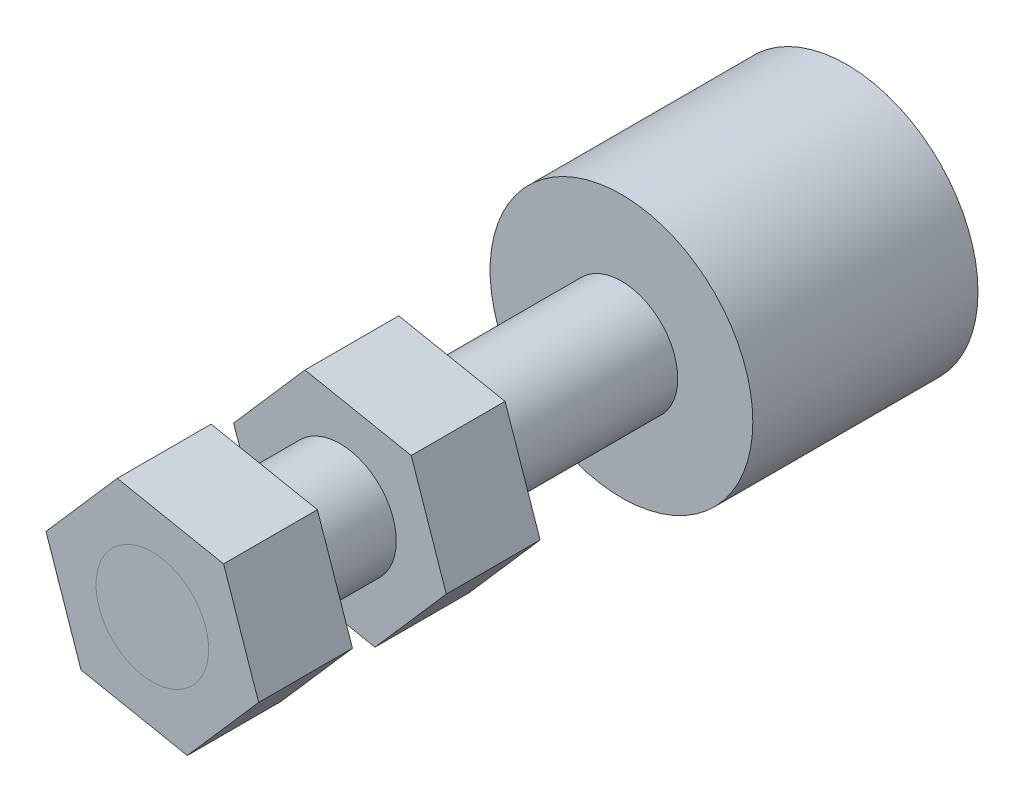
ISO-10303-21;
HEADER;
FILE_DESCRIPTION(('STEP AP214'),'2;1');
FILE_NAME('part.step','',(''),(''),'','','');
FILE_SCHEMA(('AUTOMOTIVE_DESIGN { 1 0 10303 214 1 1 1 1 }'));
ENDSEC;
DATA;
#1=APPLICATION_CONTEXT('core data for automotive mechanical design processes');
#2=APPLICATION_PROTOCOL_DEFINITION('international standard','automotive_design',2000,#1);
#3=PRODUCT_CONTEXT('',#1,'mechanical');
#4=PRODUCT('Part','Part','',(#3));
#5=PRODUCT_RELATED_PRODUCT_CATEGORY('part','',(#4));
#6=PRODUCT_DEFINITION_FORMATION('','',#4);
#7=PRODUCT_DEFINITION_CONTEXT('part definition',#1,'design');
#8=PRODUCT_DEFINITION('design','',#6,#7);
#9=PRODUCT_DEFINITION_SHAPE('','',#8);
#10=(LENGTH_UNIT() NAMED_UNIT(*) SI_UNIT(.MILLI.,.METRE.));
#11=(NAMED_UNIT(*) PLANE_ANGLE_UNIT() SI_UNIT($,.RADIAN.));
#12=(NAMED_UNIT(*) SI_UNIT($,.STERADIAN.) SOLID_ANGLE_UNIT());
#13=UNCERTAINTY_MEASURE_WITH_UNIT(LENGTH_MEASURE(1.E-05),#10,'distance_accuracy_value','');
#14=(GEOMETRIC_REPRESENTATION_CONTEXT(3) GLOBAL_UNCERTAINTY_ASSIGNED_CONTEXT((#13)) GLOBAL_UNIT_ASSIGNED_CONTEXT((#10,
#11,#12)) REPRESENTATION_CONTEXT('',''));
#15=CARTESIAN_POINT('',(0.,0.,0.));
#16=DIRECTION('',(0.,0.,1.));
#17=DIRECTION('',(1.,0.,0.));
#18=AXIS2_PLACEMENT_3D('',#15,#16,#17);
#19=CARTESIAN_POINT('',(5.66475932685164,-1.11527355486477,22.));
#20=DIRECTION('',(0.946299422095933,0.32329151510812,0.));
#21=DIRECTION('',(-0.32329151510812,0.946299422095933,0.));
#22=AXIS2_PLACEMENT_3D('',#19,#20,#21);
#23=PLANE('',#22);
#24=DIRECTION('',(-0.32329151510812,0.946299422095933,0.));
#25=VECTOR('',#24,1.);
#26=CARTESIAN_POINT('',(5.66475932685164,-1.11527355486477,27.));
#27=LINE('',#26,#25);
#28=CARTESIAN_POINT('',(5.66475932685164,-1.11527355486477,27.));
#29=VERTEX_POINT('',#28);
#30=CARTESIAN_POINT('',(3.79823489410769,4.34818870594597,27.));
#31=VERTEX_POINT('',#30);
#32=EDGE_CURVE('E134',#29,#31,#27,.T.);
#33=ORIENTED_EDGE('',*,*,#32,.F.);
#34=DIRECTION('',(0.,0.,1.));
#35=VECTOR('',#34,1.);
#36=CARTESIAN_POINT('',(5.66475932685164,-1.11527355486477,22.));
#37=LINE('',#36,#35);
#38=CARTESIAN_POINT('',(5.66475932685164,-1.11527355486477,22.));
#39=VERTEX_POINT('',#38);
#40=EDGE_CURVE('E12',#39,#29,#37,.T.);
#41=ORIENTED_EDGE('',*,*,#40,.F.);
#42=DIRECTION('',(-0.32329151510812,0.946299422095933,0.));
#43=VECTOR('',#42,1.);
#44=CARTESIAN_POINT('',(5.66475932685164,-1.11527355486477,22.));
#45=LINE('',#44,#43);
#46=CARTESIAN_POINT('',(3.79823489410769,4.34818870594597,22.));
#47=VERTEX_POINT('',#46);
#48=EDGE_CURVE('E149',#39,#47,#45,.T.);
#49=ORIENTED_EDGE('',*,*,#48,.T.);
#50=DIRECTION('',(0.,0.,1.));
#51=VECTOR('',#50,1.);
#52=CARTESIAN_POINT('',(3.79823489410769,4.34818870594597,22.));
#53=LINE('',#52,#51);
#54=EDGE_CURVE('E52',#47,#31,#53,.T.);
#55=ORIENTED_EDGE('',*,*,#54,.T.);
#56=EDGE_LOOP('',(#33,#41,#49,#55));
#57=FACE_BOUND('',#56,.T.);
#58=ADVANCED_FACE('F49',(#57),#23,.T.);
#59=CARTESIAN_POINT('',(1.86652443274395,-5.46346226081074,22.));
#60=DIRECTION('',(0.753128375959559,-0.657873581567551,0.));
#61=DIRECTION('',(0.657873581567551,0.753128375959559,0.));
#62=AXIS2_PLACEMENT_3D('',#59,#60,#61);
#63=PLANE('',#62);
#64=DIRECTION('',(0.657873581567551,0.753128375959559,0.));
#65=VECTOR('',#64,1.);
#66=CARTESIAN_POINT('',(1.86652443274395,-5.46346226081074,27.));
#67=LINE('',#66,#65);
#68=CARTESIAN_POINT('',(1.86652443274395,-5.46346226081074,27.));
#69=VERTEX_POINT('',#68);
#70=EDGE_CURVE('E147',#69,#29,#67,.T.);
#71=ORIENTED_EDGE('',*,*,#70,.F.);
#72=DIRECTION('',(0.,0.,1.));
#73=VECTOR('',#72,1.);
#74=CARTESIAN_POINT('',(1.86652443274395,-5.46346226081074,22.));
#75=LINE('',#74,#73);
#76=CARTESIAN_POINT('',(1.86652443274395,-5.46346226081074,22.));
#77=VERTEX_POINT('',#76);
#78=EDGE_CURVE('E58',#77,#69,#75,.T.);
#79=ORIENTED_EDGE('',*,*,#78,.F.);
#80=DIRECTION('',(0.657873581567551,0.753128375959559,0.));
#81=VECTOR('',#80,1.);
#82=CARTESIAN_POINT('',(1.86652443274395,-5.46346226081074,22.));
#83=LINE('',#82,#81);
#84=EDGE_CURVE('E124',#77,#39,#83,.T.);
#85=ORIENTED_EDGE('',*,*,#84,.T.);
#86=ORIENTED_EDGE('',*,*,#40,.T.);
#87=EDGE_LOOP('',(#71,#79,#85,#86));
#88=FACE_BOUND('',#87,.T.);
#89=ADVANCED_FACE('F157',(#88),#63,.T.);
#90=CARTESIAN_POINT('',(-3.79823489410769,-4.34818870594597,22.));
#91=DIRECTION('',(-0.193171046136374,-0.981165096675671,0.));
#92=DIRECTION('',(0.981165096675671,-0.193171046136374,0.));
#93=AXIS2_PLACEMENT_3D('',#90,#91,#92);
#94=PLANE('',#93);
#95=DIRECTION('',(0.981165096675671,-0.193171046136374,0.));
#96=VECTOR('',#95,1.);
#97=CARTESIAN_POINT('',(-3.79823489410769,-4.34818870594597,27.));
#98=LINE('',#97,#96);
#99=CARTESIAN_POINT('',(-3.79823489410769,-4.34818870594597,27.));
#100=VERTEX_POINT('',#99);
#101=EDGE_CURVE('E111',#100,#69,#98,.T.);
#102=ORIENTED_EDGE('',*,*,#101,.F.);
#103=DIRECTION('',(0.,0.,1.));
#104=VECTOR('',#103,1.);
#105=CARTESIAN_POINT('',(-3.79823489410769,-4.34818870594597,22.));
#106=LINE('',#105,#104);
#107=CARTESIAN_POINT('',(-3.79823489410769,-4.34818870594597,22.));
#108=VERTEX_POINT('',#107);
#109=EDGE_CURVE('E106',#108,#100,#106,.T.);
#110=ORIENTED_EDGE('',*,*,#109,.F.);
#111=DIRECTION('',(0.981165096675671,-0.193171046136374,0.));
#112=VECTOR('',#111,1.);
#113=CARTESIAN_POINT('',(-3.79823489410769,-4.34818870594597,22.));
#114=LINE('',#113,#112);
#115=EDGE_CURVE('E109',#108,#77,#114,.T.);
#116=ORIENTED_EDGE('',*,*,#115,.T.);
#117=ORIENTED_EDGE('',*,*,#78,.T.);
#118=EDGE_LOOP('',(#102,#110,#116,#117));
#119=FACE_BOUND('',#118,.T.);
#120=ADVANCED_FACE('F108',(#119),#94,.T.);
#121=CARTESIAN_POINT('',(-5.66475932685164,1.11527355486477,22.));
#122=DIRECTION('',(-0.946299422095933,-0.32329151510812,0.));
#123=DIRECTION('',(0.32329151510812,-0.946299422095933,0.));
#124=AXIS2_PLACEMENT_3D('',#121,#122,#123);
#125=PLANE('',#124);
#126=DIRECTION('',(0.32329151510812,-0.946299422095933,0.));
#127=VECTOR('',#126,1.);
#128=CARTESIAN_POINT('',(-5.66475932685164,1.11527355486477,27.));
#129=LINE('',#128,#127);
#130=CARTESIAN_POINT('',(-5.66475932685164,1.11527355486477,27.));
#131=VERTEX_POINT('',#130);
#132=EDGE_CURVE('E144',#131,#100,#129,.T.);
#133=ORIENTED_EDGE('',*,*,#132,.F.);
#134=DIRECTION('',(0.,0.,1.));
#135=VECTOR('',#134,1.);
#136=CARTESIAN_POINT('',(-5.66475932685164,1.11527355486477,22.));
#137=LINE('',#136,#135);
#138=CARTESIAN_POINT('',(-5.66475932685164,1.11527355486477,22.));
#139=VERTEX_POINT('',#138);
#140=EDGE_CURVE('E116',#139,#131,#137,.T.);
#141=ORIENTED_EDGE('',*,*,#140,.F.);
#142=DIRECTION('',(0.32329151510812,-0.946299422095933,0.));
#143=VECTOR('',#142,1.);
#144=CARTESIAN_POINT('',(-5.66475932685164,1.11527355486477,22.));
#145=LINE('',#144,#143);
#146=EDGE_CURVE('E122',#139,#108,#145,.T.);
#147=ORIENTED_EDGE('',*,*,#146,.T.);
#148=ORIENTED_EDGE('',*,*,#109,.T.);
#149=EDGE_LOOP('',(#133,#141,#147,#148));
#150=FACE_BOUND('',#149,.T.);
#151=ADVANCED_FACE('F126',(#150),#125,.T.);
#152=CARTESIAN_POINT('',(-1.86652443274395,5.46346226081074,22.));
#153=DIRECTION('',(-0.753128375959559,0.657873581567551,0.));
#154=DIRECTION('',(-0.657873581567551,-0.753128375959559,0.));
#155=AXIS2_PLACEMENT_3D('',#152,#153,#154);
#156=PLANE('',#155);
#157=DIRECTION('',(-0.657873581567551,-0.753128375959559,0.));
#158=VECTOR('',#157,1.);
#159=CARTESIAN_POINT('',(-1.86652443274395,5.46346226081074,27.));
#160=LINE('',#159,#158);
#161=CARTESIAN_POINT('',(-1.86652443274395,5.46346226081074,27.));
#162=VERTEX_POINT('',#161);
#163=EDGE_CURVE('E141',#162,#131,#160,.T.);
#164=ORIENTED_EDGE('',*,*,#163,.F.);
#165=DIRECTION('',(0.,0.,1.));
#166=VECTOR('',#165,1.);
#167=CARTESIAN_POINT('',(-1.86652443274395,5.46346226081074,22.));
#168=LINE('',#167,#166);
#169=CARTESIAN_POINT('',(-1.86652443274395,5.46346226081074,22.));
#170=VERTEX_POINT('',#169);
#171=EDGE_CURVE('E152',#170,#162,#168,.T.);
#172=ORIENTED_EDGE('',*,*,#171,.F.);
#173=DIRECTION('',(-0.657873581567551,-0.753128375959559,0.));
#174=VECTOR('',#173,1.);
#175=CARTESIAN_POINT('',(-1.86652443274395,5.46346226081074,22.));
#176=LINE('',#175,#174);
#177=EDGE_CURVE('E127',#170,#139,#176,.T.);
#178=ORIENTED_EDGE('',*,*,#177,.T.);
#179=ORIENTED_EDGE('',*,*,#140,.T.);
#180=EDGE_LOOP('',(#164,#172,#178,#179));
#181=FACE_BOUND('',#180,.T.);
#182=ADVANCED_FACE('F170',(#181),#156,.T.);
#183=CARTESIAN_POINT('',(3.79823489410769,4.34818870594597,22.));
#184=DIRECTION('',(0.193171046136374,0.981165096675671,0.));
#185=DIRECTION('',(-0.981165096675671,0.193171046136374,0.));
#186=AXIS2_PLACEMENT_3D('',#183,#184,#185);
#187=PLANE('',#186);
#188=DIRECTION('',(-0.981165096675671,0.193171046136374,0.));
#189=VECTOR('',#188,1.);
#190=CARTESIAN_POINT('',(3.79823489410769,4.34818870594597,27.));
#191=LINE('',#190,#189);
#192=EDGE_CURVE('E137',#31,#162,#191,.T.);
#193=ORIENTED_EDGE('',*,*,#192,.F.);
#194=ORIENTED_EDGE('',*,*,#54,.F.);
#195=DIRECTION('',(-0.981165096675671,0.193171046136374,0.));
#196=VECTOR('',#195,1.);
#197=CARTESIAN_POINT('',(3.79823489410769,4.34818870594597,22.));
#198=LINE('',#197,#196);
#199=EDGE_CURVE('E129',#47,#170,#198,.T.);
#200=ORIENTED_EDGE('',*,*,#199,.T.);
#201=ORIENTED_EDGE('',*,*,#171,.T.);
#202=EDGE_LOOP('',(#193,#194,#200,#201));
#203=FACE_BOUND('',#202,.T.);
#204=ADVANCED_FACE('F154',(#203),#187,.T.);
#205=CARTESIAN_POINT('',(0.,0.,22.));
#206=DIRECTION('',(0.,0.,1.));
#207=DIRECTION('',(1.,0.,0.));
#208=AXIS2_PLACEMENT_3D('',#205,#206,#207);
#209=PLANE('',#208);
#210=CARTESIAN_POINT('',(0.,0.,22.));
#211=DIRECTION('',(0.,0.,1.));
#212=DIRECTION('',(1.,0.,0.));
#213=AXIS2_PLACEMENT_3D('',#210,#211,#212);
#214=CIRCLE('',#213,3.);
#215=CARTESIAN_POINT('',(3.,0.,22.));
#216=VERTEX_POINT('',#215);
#217=EDGE_CURVE('E138',#216,#216,#214,.T.);
#218=ORIENTED_EDGE('',*,*,#217,.T.);
#219=EDGE_LOOP('',(#218));
#220=FACE_BOUND('',#219,.T.);
#221=ORIENTED_EDGE('',*,*,#48,.F.);
#222=ORIENTED_EDGE('',*,*,#84,.F.);
#223=ORIENTED_EDGE('',*,*,#115,.F.);
#224=ORIENTED_EDGE('',*,*,#146,.F.);
#225=ORIENTED_EDGE('',*,*,#177,.F.);
#226=ORIENTED_EDGE('',*,*,#199,.F.);
#227=EDGE_LOOP('',(#221,#222,#223,#224,#225,#226));
#228=FACE_BOUND('',#227,.T.);
#229=ADVANCED_FACE('F120',(#220,#228),#209,.F.);
#230=CARTESIAN_POINT('',(0.,0.,27.));
#231=DIRECTION('',(0.,0.,1.));
#232=DIRECTION('',(1.,0.,0.));
#233=AXIS2_PLACEMENT_3D('',#230,#231,#232);
#234=PLANE('',#233);
#235=CARTESIAN_POINT('',(0.,0.,27.));
#236=DIRECTION('',(0.,0.,1.));
#237=DIRECTION('',(1.,0.,0.));
#238=AXIS2_PLACEMENT_3D('',#235,#236,#237);
#239=CIRCLE('',#238,3.);
#240=CARTESIAN_POINT('',(3.,0.,27.));
#241=VERTEX_POINT('',#240);
#242=EDGE_CURVE('E194',#241,#241,#239,.T.);
#243=ORIENTED_EDGE('',*,*,#242,.F.);
#244=EDGE_LOOP('',(#243));
#245=FACE_BOUND('',#244,.T.);
#246=ORIENTED_EDGE('',*,*,#32,.T.);
#247=ORIENTED_EDGE('',*,*,#192,.T.);
#248=ORIENTED_EDGE('',*,*,#163,.T.);
#249=ORIENTED_EDGE('',*,*,#132,.T.);
#250=ORIENTED_EDGE('',*,*,#101,.T.);
#251=ORIENTED_EDGE('',*,*,#70,.T.);
#252=EDGE_LOOP('',(#246,#247,#248,#249,#250,#251));
#253=FACE_BOUND('',#252,.T.);
#254=ADVANCED_FACE('F156',(#245,#253),#234,.T.);
#255=CARTESIAN_POINT('',(0.,0.,22.));
#256=DIRECTION('',(0.,0.,1.));
#257=DIRECTION('',(1.,0.,0.));
#258=AXIS2_PLACEMENT_3D('',#255,#256,#257);
#259=CYLINDRICAL_SURFACE('',#258,3.);
#260=ORIENTED_EDGE('',*,*,#217,.F.);
#261=EDGE_LOOP('',(#260));
#262=FACE_BOUND('',#261,.T.);
#263=ORIENTED_EDGE('',*,*,#242,.T.);
#264=EDGE_LOOP('',(#263));
#265=FACE_BOUND('',#264,.T.);
#266=ADVANCED_FACE('F181',(#262,#265),#259,.F.);
#267=CLOSED_SHELL('',(#58,#89,#120,#151,#182,#204,#229,#254,#266));
#268=MANIFOLD_SOLID_BREP('B2',#267);
#269=CARTESIAN_POINT('',(5.66475932685164,-1.11527355486477,32.));
#270=DIRECTION('',(0.946299422095933,0.32329151510812,0.));
#271=DIRECTION('',(-0.32329151510812,0.946299422095933,0.));
#272=AXIS2_PLACEMENT_3D('',#269,#270,#271);
#273=PLANE('',#272);
#274=DIRECTION('',(-0.32329151510812,0.946299422095933,0.));
#275=VECTOR('',#274,1.);
#276=CARTESIAN_POINT('',(5.66475932685164,-1.11527355486477,37.));
#277=LINE('',#276,#275);
#278=CARTESIAN_POINT('',(5.66475932685164,-1.11527355486477,37.));
#279=VERTEX_POINT('',#278);
#280=CARTESIAN_POINT('',(3.79823489410769,4.34818870594597,37.));
#281=VERTEX_POINT('',#280);
#282=EDGE_CURVE('E345',#279,#281,#277,.T.);
#283=ORIENTED_EDGE('',*,*,#282,.F.);
#284=DIRECTION('',(0.,0.,1.));
#285=VECTOR('',#284,1.);
#286=CARTESIAN_POINT('',(5.66475932685164,-1.11527355486477,32.));
#287=LINE('',#286,#285);
#288=CARTESIAN_POINT('',(5.66475932685164,-1.11527355486477,32.));
#289=VERTEX_POINT('',#288);
#290=EDGE_CURVE('E47',#289,#279,#287,.T.);
#291=ORIENTED_EDGE('',*,*,#290,.F.);
#292=DIRECTION('',(-0.32329151510812,0.946299422095933,0.));
#293=VECTOR('',#292,1.);
#294=CARTESIAN_POINT('',(5.66475932685164,-1.11527355486477,32.));
#295=LINE('',#294,#293);
#296=CARTESIAN_POINT('',(3.79823489410769,4.34818870594597,32.));
#297=VERTEX_POINT('',#296);
#298=EDGE_CURVE('E360',#289,#297,#295,.T.);
#299=ORIENTED_EDGE('',*,*,#298,.T.);
#300=DIRECTION('',(0.,0.,1.));
#301=VECTOR('',#300,1.);
#302=CARTESIAN_POINT('',(3.79823489410769,4.34818870594597,32.));
#303=LINE('',#302,#301);
#304=EDGE_CURVE('E263',#297,#281,#303,.T.);
#305=ORIENTED_EDGE('',*,*,#304,.T.);
#306=EDGE_LOOP('',(#283,#291,#299,#305));
#307=FACE_BOUND('',#306,.T.);
#308=ADVANCED_FACE('F260',(#307),#273,.T.);
#309=CARTESIAN_POINT('',(1.86652443274395,-5.46346226081074,32.));
#310=DIRECTION('',(0.753128375959559,-0.657873581567551,0.));
#311=DIRECTION('',(0.657873581567551,0.753128375959559,0.));
#312=AXIS2_PLACEMENT_3D('',#309,#310,#311);
#313=PLANE('',#312);
#314=DIRECTION('',(0.657873581567551,0.753128375959559,0.));
#315=VECTOR('',#314,1.);
#316=CARTESIAN_POINT('',(1.86652443274395,-5.46346226081074,37.));
#317=LINE('',#316,#315);
#318=CARTESIAN_POINT('',(1.86652443274395,-5.46346226081074,37.));
#319=VERTEX_POINT('',#318);
#320=EDGE_CURVE('E358',#319,#279,#317,.T.);
#321=ORIENTED_EDGE('',*,*,#320,.F.);
#322=DIRECTION('',(0.,0.,1.));
#323=VECTOR('',#322,1.);
#324=CARTESIAN_POINT('',(1.86652443274395,-5.46346226081074,32.));
#325=LINE('',#324,#323);
#326=CARTESIAN_POINT('',(1.86652443274395,-5.46346226081074,32.));
#327=VERTEX_POINT('',#326);
#328=EDGE_CURVE('E269',#327,#319,#325,.T.);
#329=ORIENTED_EDGE('',*,*,#328,.F.);
#330=DIRECTION('',(0.657873581567551,0.753128375959559,0.));
#331=VECTOR('',#330,1.);
#332=CARTESIAN_POINT('',(1.86652443274395,-5.46346226081074,32.));
#333=LINE('',#332,#331);
#334=EDGE_CURVE('E335',#327,#289,#333,.T.);
#335=ORIENTED_EDGE('',*,*,#334,.T.);
#336=ORIENTED_EDGE('',*,*,#290,.T.);
#337=EDGE_LOOP('',(#321,#329,#335,#336));
#338=FACE_BOUND('',#337,.T.);
#339=ADVANCED_FACE('F368',(#338),#313,.T.);
#340=CARTESIAN_POINT('',(-3.79823489410769,-4.34818870594597,32.));
#341=DIRECTION('',(-0.193171046136374,-0.981165096675671,0.));
#342=DIRECTION('',(0.981165096675671,-0.193171046136374,0.));
#343=AXIS2_PLACEMENT_3D('',#340,#341,#342);
#344=PLANE('',#343);
#345=DIRECTION('',(0.981165096675671,-0.193171046136374,0.));
#346=VECTOR('',#345,1.);
#347=CARTESIAN_POINT('',(-3.79823489410769,-4.34818870594597,37.));
#348=LINE('',#347,#346);
#349=CARTESIAN_POINT('',(-3.79823489410769,-4.34818870594597,37.));
#350=VERTEX_POINT('',#349);
#351=EDGE_CURVE('E322',#350,#319,#348,.T.);
#352=ORIENTED_EDGE('',*,*,#351,.F.);
#353=DIRECTION('',(0.,0.,1.));
#354=VECTOR('',#353,1.);
#355=CARTESIAN_POINT('',(-3.79823489410769,-4.34818870594597,32.));
#356=LINE('',#355,#354);
#357=CARTESIAN_POINT('',(-3.79823489410769,-4.34818870594597,32.));
#358=VERTEX_POINT('',#357);
#359=EDGE_CURVE('E317',#358,#350,#356,.T.);
#360=ORIENTED_EDGE('',*,*,#359,.F.);
#361=DIRECTION('',(0.981165096675671,-0.193171046136374,0.));
#362=VECTOR('',#361,1.);
#363=CARTESIAN_POINT('',(-3.79823489410769,-4.34818870594597,32.));
#364=LINE('',#363,#362);
#365=EDGE_CURVE('E320',#358,#327,#364,.T.);
#366=ORIENTED_EDGE('',*,*,#365,.T.);
#367=ORIENTED_EDGE('',*,*,#328,.T.);
#368=EDGE_LOOP('',(#352,#360,#366,#367));
#369=FACE_BOUND('',#368,.T.);
#370=ADVANCED_FACE('F319',(#369),#344,.T.);
#371=CARTESIAN_POINT('',(-5.66475932685164,1.11527355486477,32.));
#372=DIRECTION('',(-0.946299422095933,-0.32329151510812,0.));
#373=DIRECTION('',(0.32329151510812,-0.946299422095933,0.));
#374=AXIS2_PLACEMENT_3D('',#371,#372,#373);
#375=PLANE('',#374);
#376=DIRECTION('',(0.32329151510812,-0.946299422095933,0.));
#377=VECTOR('',#376,1.);
#378=CARTESIAN_POINT('',(-5.66475932685164,1.11527355486477,37.));
#379=LINE('',#378,#377);
#380=CARTESIAN_POINT('',(-5.66475932685164,1.11527355486477,37.));
#381=VERTEX_POINT('',#380);
#382=EDGE_CURVE('E355',#381,#350,#379,.T.);
#383=ORIENTED_EDGE('',*,*,#382,.F.);
#384=DIRECTION('',(0.,0.,1.));
#385=VECTOR('',#384,1.);
#386=CARTESIAN_POINT('',(-5.66475932685164,1.11527355486477,32.));
#387=LINE('',#386,#385);
#388=CARTESIAN_POINT('',(-5.66475932685164,1.11527355486477,32.));
#389=VERTEX_POINT('',#388);
#390=EDGE_CURVE('E327',#389,#381,#387,.T.);
#391=ORIENTED_EDGE('',*,*,#390,.F.);
#392=DIRECTION('',(0.32329151510812,-0.946299422095933,0.));
#393=VECTOR('',#392,1.);
#394=CARTESIAN_POINT('',(-5.66475932685164,1.11527355486477,32.));
#395=LINE('',#394,#393);
#396=EDGE_CURVE('E333',#389,#358,#395,.T.);
#397=ORIENTED_EDGE('',*,*,#396,.T.);
#398=ORIENTED_EDGE('',*,*,#359,.T.);
#399=EDGE_LOOP('',(#383,#391,#397,#398));
#400=FACE_BOUND('',#399,.T.);
#401=ADVANCED_FACE('F337',(#400),#375,.T.);
#402=CARTESIAN_POINT('',(-1.86652443274395,5.46346226081074,32.));
#403=DIRECTION('',(-0.753128375959559,0.657873581567551,0.));
#404=DIRECTION('',(-0.657873581567551,-0.753128375959559,0.));
#405=AXIS2_PLACEMENT_3D('',#402,#403,#404);
#406=PLANE('',#405);
#407=DIRECTION('',(-0.657873581567551,-0.753128375959559,0.));
#408=VECTOR('',#407,1.);
#409=CARTESIAN_POINT('',(-1.86652443274395,5.46346226081074,37.));
#410=LINE('',#409,#408);
#411=CARTESIAN_POINT('',(-1.86652443274395,5.46346226081074,37.));
#412=VERTEX_POINT('',#411);
#413=EDGE_CURVE('E352',#412,#381,#410,.T.);
#414=ORIENTED_EDGE('',*,*,#413,.F.);
#415=DIRECTION('',(0.,0.,1.));
#416=VECTOR('',#415,1.);
#417=CARTESIAN_POINT('',(-1.86652443274395,5.46346226081074,32.));
#418=LINE('',#417,#416);
#419=CARTESIAN_POINT('',(-1.86652443274395,5.46346226081074,32.));
#420=VERTEX_POINT('',#419);
#421=EDGE_CURVE('E363',#420,#412,#418,.T.);
#422=ORIENTED_EDGE('',*,*,#421,.F.);
#423=DIRECTION('',(-0.657873581567551,-0.753128375959559,0.));
#424=VECTOR('',#423,1.);
#425=CARTESIAN_POINT('',(-1.86652443274395,5.46346226081074,32.));
#426=LINE('',#425,#424);
#427=EDGE_CURVE('E338',#420,#389,#426,.T.);
#428=ORIENTED_EDGE('',*,*,#427,.T.);
#429=ORIENTED_EDGE('',*,*,#390,.T.);
#430=EDGE_LOOP('',(#414,#422,#428,#429));
#431=FACE_BOUND('',#430,.T.);
#432=ADVANCED_FACE('F381',(#431),#406,.T.);
#433=CARTESIAN_POINT('',(3.79823489410769,4.34818870594597,32.));
#434=DIRECTION('',(0.193171046136374,0.981165096675671,0.));
#435=DIRECTION('',(-0.981165096675671,0.193171046136374,0.));
#436=AXIS2_PLACEMENT_3D('',#433,#434,#435);
#437=PLANE('',#436);
#438=DIRECTION('',(-0.981165096675671,0.193171046136374,0.));
#439=VECTOR('',#438,1.);
#440=CARTESIAN_POINT('',(3.79823489410769,4.34818870594597,37.));
#441=LINE('',#440,#439);
#442=EDGE_CURVE('E348',#281,#412,#441,.T.);
#443=ORIENTED_EDGE('',*,*,#442,.F.);
#444=ORIENTED_EDGE('',*,*,#304,.F.);
#445=DIRECTION('',(-0.981165096675671,0.193171046136374,0.));
#446=VECTOR('',#445,1.);
#447=CARTESIAN_POINT('',(3.79823489410769,4.34818870594597,32.));
#448=LINE('',#447,#446);
#449=EDGE_CURVE('E340',#297,#420,#448,.T.);
#450=ORIENTED_EDGE('',*,*,#449,.T.);
#451=ORIENTED_EDGE('',*,*,#421,.T.);
#452=EDGE_LOOP('',(#443,#444,#450,#451));
#453=FACE_BOUND('',#452,.T.);
#454=ADVANCED_FACE('F365',(#453),#437,.T.);
#455=CARTESIAN_POINT('',(0.,0.,32.));
#456=DIRECTION('',(0.,0.,1.));
#457=DIRECTION('',(1.,0.,0.));
#458=AXIS2_PLACEMENT_3D('',#455,#456,#457);
#459=PLANE('',#458);
#460=CARTESIAN_POINT('',(0.,0.,32.));
#461=DIRECTION('',(0.,0.,1.));
#462=DIRECTION('',(1.,0.,0.));
#463=AXIS2_PLACEMENT_3D('',#460,#461,#462);
#464=CIRCLE('',#463,3.);
#465=CARTESIAN_POINT('',(3.,0.,32.));
#466=VERTEX_POINT('',#465);
#467=EDGE_CURVE('E349',#466,#466,#464,.T.);
#468=ORIENTED_EDGE('',*,*,#467,.T.);
#469=EDGE_LOOP('',(#468));
#470=FACE_BOUND('',#469,.T.);
#471=ORIENTED_EDGE('',*,*,#298,.F.);
#472=ORIENTED_EDGE('',*,*,#334,.F.);
#473=ORIENTED_EDGE('',*,*,#365,.F.);
#474=ORIENTED_EDGE('',*,*,#396,.F.);
#475=ORIENTED_EDGE('',*,*,#427,.F.);
#476=ORIENTED_EDGE('',*,*,#449,.F.);
#477=EDGE_LOOP('',(#471,#472,#473,#474,#475,#476));
#478=FACE_BOUND('',#477,.T.);
#479=ADVANCED_FACE('F331',(#470,#478),#459,.F.);
#480=CARTESIAN_POINT('',(0.,0.,37.));
#481=DIRECTION('',(0.,0.,1.));
#482=DIRECTION('',(1.,0.,0.));
#483=AXIS2_PLACEMENT_3D('',#480,#481,#482);
#484=PLANE('',#483);
#485=CARTESIAN_POINT('',(0.,0.,37.));
#486=DIRECTION('',(0.,0.,1.));
#487=DIRECTION('',(1.,0.,0.));
#488=AXIS2_PLACEMENT_3D('',#485,#486,#487);
#489=CIRCLE('',#488,3.);
#490=CARTESIAN_POINT('',(3.,0.,37.));
#491=VERTEX_POINT('',#490);
#492=EDGE_CURVE('E404',#491,#491,#489,.T.);
#493=ORIENTED_EDGE('',*,*,#492,.F.);
#494=EDGE_LOOP('',(#493));
#495=FACE_BOUND('',#494,.T.);
#496=ORIENTED_EDGE('',*,*,#282,.T.);
#497=ORIENTED_EDGE('',*,*,#442,.T.);
#498=ORIENTED_EDGE('',*,*,#413,.T.);
#499=ORIENTED_EDGE('',*,*,#382,.T.);
#500=ORIENTED_EDGE('',*,*,#351,.T.);
#501=ORIENTED_EDGE('',*,*,#320,.T.);
#502=EDGE_LOOP('',(#496,#497,#498,#499,#500,#501));
#503=FACE_BOUND('',#502,.T.);
#504=ADVANCED_FACE('F367',(#495,#503),#484,.T.);
#505=CARTESIAN_POINT('',(0.,0.,32.));
#506=DIRECTION('',(0.,0.,1.));
#507=DIRECTION('',(1.,0.,0.));
#508=AXIS2_PLACEMENT_3D('',#505,#506,#507);
#509=CYLINDRICAL_SURFACE('',#508,3.);
#510=ORIENTED_EDGE('',*,*,#467,.F.);
#511=EDGE_LOOP('',(#510));
#512=FACE_BOUND('',#511,.T.);
#513=ORIENTED_EDGE('',*,*,#492,.T.);
#514=EDGE_LOOP('',(#513));
#515=FACE_BOUND('',#514,.T.);
#516=ADVANCED_FACE('F392',(#512,#515),#509,.F.);
#517=CLOSED_SHELL('',(#308,#339,#370,#401,#432,#454,#479,#504,#516));
#518=MANIFOLD_SOLID_BREP('B6',#517);
#519=CARTESIAN_POINT('',(0.,0.,12.));
#520=DIRECTION('',(0.,0.,-1.));
#521=DIRECTION('',(-1.,0.,0.));
#522=AXIS2_PLACEMENT_3D('',#519,#520,#521);
#523=CYLINDRICAL_SURFACE('',#522,7.);
#524=CARTESIAN_POINT('',(0.,0.,12.));
#525=DIRECTION('',(0.,0.,1.));
#526=DIRECTION('',(1.,0.,0.));
#527=AXIS2_PLACEMENT_3D('',#524,#525,#526);
#528=CIRCLE('',#527,7.);
#529=CARTESIAN_POINT('',(7.,0.,12.));
#530=VERTEX_POINT('',#529);
#531=EDGE_CURVE('E484',#530,#530,#528,.T.);
#532=ORIENTED_EDGE('',*,*,#531,.F.);
#533=EDGE_LOOP('',(#532));
#534=FACE_BOUND('',#533,.T.);
#535=CARTESIAN_POINT('',(0.,0.,0.));
#536=DIRECTION('',(0.,0.,1.));
#537=DIRECTION('',(1.,0.,0.));
#538=AXIS2_PLACEMENT_3D('',#535,#536,#537);
#539=CIRCLE('',#538,7.);
#540=CARTESIAN_POINT('',(7.,0.,0.));
#541=VERTEX_POINT('',#540);
#542=EDGE_CURVE('E480',#541,#541,#539,.T.);
#543=ORIENTED_EDGE('',*,*,#542,.T.);
#544=EDGE_LOOP('',(#543));
#545=FACE_BOUND('',#544,.T.);
#546=ADVANCED_FACE('F477',(#534,#545),#523,.T.);
#547=CARTESIAN_POINT('',(0.,0.,12.));
#548=DIRECTION('',(0.,0.,1.));
#549=DIRECTION('',(1.,0.,0.));
#550=AXIS2_PLACEMENT_3D('',#547,#548,#549);
#551=PLANE('',#550);
#552=CARTESIAN_POINT('',(0.,0.,12.));
#553=DIRECTION('',(0.,0.,1.));
#554=DIRECTION('',(1.,0.,0.));
#555=AXIS2_PLACEMENT_3D('',#552,#553,#554);
#556=CIRCLE('',#555,3.);
#557=CARTESIAN_POINT('',(3.,0.,12.));
#558=VERTEX_POINT('',#557);
#559=EDGE_CURVE('E259',#558,#558,#556,.T.);
#560=ORIENTED_EDGE('',*,*,#559,.F.);
#561=EDGE_LOOP('',(#560));
#562=FACE_BOUND('',#561,.T.);
#563=ORIENTED_EDGE('',*,*,#531,.T.);
#564=EDGE_LOOP('',(#563));
#565=FACE_BOUND('',#564,.T.);
#566=ADVANCED_FACE('F501',(#562,#565),#551,.T.);
#567=CARTESIAN_POINT('',(0.,0.,0.));
#568=DIRECTION('',(0.,0.,1.));
#569=DIRECTION('',(1.,0.,0.));
#570=AXIS2_PLACEMENT_3D('',#567,#568,#569);
#571=PLANE('',#570);
#572=ORIENTED_EDGE('',*,*,#542,.F.);
#573=EDGE_LOOP('',(#572));
#574=FACE_BOUND('',#573,.T.);
#575=ADVANCED_FACE('F498',(#574),#571,.F.);
#576=CARTESIAN_POINT('',(0.,0.,37.));
#577=DIRECTION('',(0.,0.,-1.));
#578=DIRECTION('',(-1.,0.,0.));
#579=AXIS2_PLACEMENT_3D('',#576,#577,#578);
#580=CYLINDRICAL_SURFACE('',#579,3.);
#581=CARTESIAN_POINT('',(0.,0.,37.));
#582=DIRECTION('',(0.,0.,1.));
#583=DIRECTION('',(1.,0.,0.));
#584=AXIS2_PLACEMENT_3D('',#581,#582,#583);
#585=CIRCLE('',#584,3.);
#586=CARTESIAN_POINT('',(3.,0.,37.));
#587=VERTEX_POINT('',#586);
#588=EDGE_CURVE('E490',#587,#587,#585,.T.);
#589=ORIENTED_EDGE('',*,*,#588,.F.);
#590=EDGE_LOOP('',(#589));
#591=FACE_BOUND('',#590,.T.);
#592=ORIENTED_EDGE('',*,*,#559,.T.);
#593=EDGE_LOOP('',(#592));
#594=FACE_BOUND('',#593,.T.);
#595=ADVANCED_FACE('F500',(#591,#594),#580,.T.);
#596=CARTESIAN_POINT('',(0.,0.,37.));
#597=DIRECTION('',(0.,0.,1.));
#598=DIRECTION('',(1.,0.,0.));
#599=AXIS2_PLACEMENT_3D('',#596,#597,#598);
#600=PLANE('',#599);
#601=ORIENTED_EDGE('',*,*,#588,.T.);
#602=EDGE_LOOP('',(#601));
#603=FACE_BOUND('',#602,.T.);
#604=ADVANCED_FACE('F506',(#603),#600,.T.);
#605=CLOSED_SHELL('',(#546,#566,#575,#595,#604));
#606=MANIFOLD_SOLID_BREP('B41',#605);
#607=ADVANCED_BREP_SHAPE_REPRESENTATION('',(#18,#268,#518,#606),#14);
#608=SHAPE_DEFINITION_REPRESENTATION(#9,#607);
ENDSEC;
END-ISO-10303-21;
